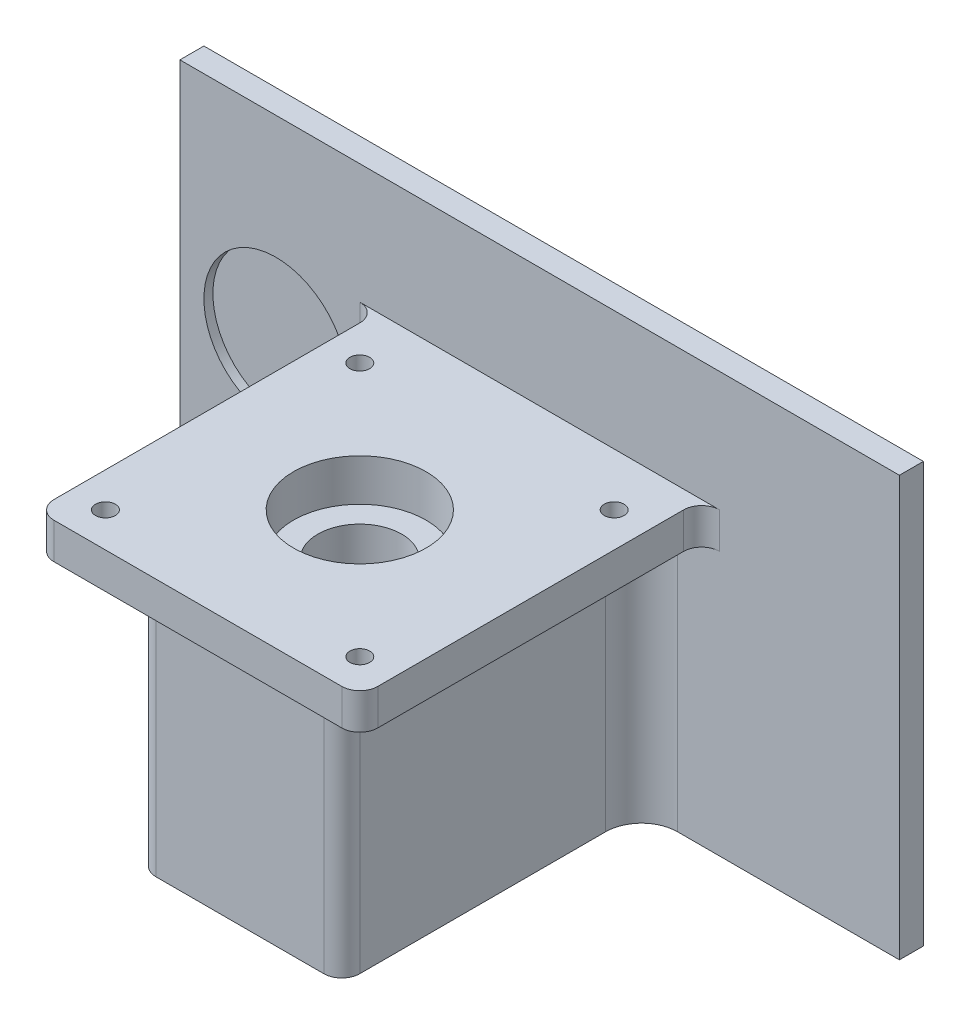
ISO-10303-21;
HEADER;
FILE_DESCRIPTION(('STEP AP214'),'2;1');
FILE_NAME('part.step','',(''),(''),'','','');
FILE_SCHEMA(('AUTOMOTIVE_DESIGN { 1 0 10303 214 1 1 1 1 }'));
ENDSEC;
DATA;
#1=APPLICATION_CONTEXT('core data for automotive mechanical design processes');
#2=APPLICATION_PROTOCOL_DEFINITION('international standard','automotive_design',2000,#1);
#3=PRODUCT_CONTEXT('',#1,'mechanical');
#4=PRODUCT('Part','Part','',(#3));
#5=PRODUCT_RELATED_PRODUCT_CATEGORY('part','',(#4));
#6=PRODUCT_DEFINITION_FORMATION('','',#4);
#7=PRODUCT_DEFINITION_CONTEXT('part definition',#1,'design');
#8=PRODUCT_DEFINITION('design','',#6,#7);
#9=PRODUCT_DEFINITION_SHAPE('','',#8);
#10=(LENGTH_UNIT() NAMED_UNIT(*) SI_UNIT(.MILLI.,.METRE.));
#11=(NAMED_UNIT(*) PLANE_ANGLE_UNIT() SI_UNIT($,.RADIAN.));
#12=(NAMED_UNIT(*) SI_UNIT($,.STERADIAN.) SOLID_ANGLE_UNIT());
#13=UNCERTAINTY_MEASURE_WITH_UNIT(LENGTH_MEASURE(1.E-05),#10,'distance_accuracy_value','');
#14=(GEOMETRIC_REPRESENTATION_CONTEXT(3) GLOBAL_UNCERTAINTY_ASSIGNED_CONTEXT((#13)) GLOBAL_UNIT_ASSIGNED_CONTEXT((#10,
#11,#12)) REPRESENTATION_CONTEXT('',''));
#15=CARTESIAN_POINT('',(0.,0.,0.));
#16=DIRECTION('',(0.,0.,1.));
#17=DIRECTION('',(1.,0.,0.));
#18=AXIS2_PLACEMENT_3D('',#15,#16,#17);
#19=CARTESIAN_POINT('',(0.,35.,34.));
#20=DIRECTION('',(0.,-1.,0.));
#21=DIRECTION('',(1.,0.,0.));
#22=AXIS2_PLACEMENT_3D('',#19,#20,#21);
#23=CYLINDRICAL_SURFACE('',#22,7.);
#24=CARTESIAN_POINT('',(0.,-28.,34.));
#25=DIRECTION('',(0.,-1.,0.));
#26=DIRECTION('',(1.,0.,0.));
#27=AXIS2_PLACEMENT_3D('',#24,#25,#26);
#28=CIRCLE('',#27,7.);
#29=CARTESIAN_POINT('',(7.,-28.,34.));
#30=VERTEX_POINT('',#29);
#31=EDGE_CURVE('E215',#30,#30,#28,.T.);
#32=ORIENTED_EDGE('',*,*,#31,.T.);
#33=EDGE_LOOP('',(#32));
#34=FACE_BOUND('',#33,.T.);
#35=CARTESIAN_POINT('',(0.,8.,34.));
#36=DIRECTION('',(0.,1.,0.));
#37=DIRECTION('',(-1.,0.,0.));
#38=AXIS2_PLACEMENT_3D('',#35,#36,#37);
#39=CIRCLE('',#38,7.);
#40=CARTESIAN_POINT('',(-7.,8.,34.));
#41=VERTEX_POINT('',#40);
#42=EDGE_CURVE('E208',#41,#41,#39,.F.);
#43=ORIENTED_EDGE('',*,*,#42,.F.);
#44=EDGE_LOOP('',(#43));
#45=FACE_BOUND('',#44,.T.);
#46=ADVANCED_FACE('F39',(#34,#45),#23,.F.);
#47=CARTESIAN_POINT('',(-60.,35.,4.));
#48=DIRECTION('',(0.,-1.,0.));
#49=DIRECTION('',(1.,0.,0.));
#50=AXIS2_PLACEMENT_3D('',#47,#48,#49);
#51=PLANE('',#50);
#52=DIRECTION('',(-1.,0.,0.));
#53=VECTOR('',#52,1.);
#54=CARTESIAN_POINT('',(-60.,35.,0.));
#55=LINE('',#54,#53);
#56=CARTESIAN_POINT('',(60.,35.,0.));
#57=VERTEX_POINT('',#56);
#58=CARTESIAN_POINT('',(-60.,35.,0.));
#59=VERTEX_POINT('',#58);
#60=EDGE_CURVE('E198',#57,#59,#55,.T.);
#61=ORIENTED_EDGE('',*,*,#60,.T.);
#62=DIRECTION('',(0.,0.,-1.));
#63=VECTOR('',#62,1.);
#64=CARTESIAN_POINT('',(-60.,35.,4.));
#65=LINE('',#64,#63);
#66=CARTESIAN_POINT('',(-60.,35.,4.));
#67=VERTEX_POINT('',#66);
#68=EDGE_CURVE('E177',#67,#59,#65,.T.);
#69=ORIENTED_EDGE('',*,*,#68,.F.);
#70=DIRECTION('',(-1.,0.,0.));
#71=VECTOR('',#70,1.);
#72=CARTESIAN_POINT('',(-60.,35.,4.));
#73=LINE('',#72,#71);
#74=CARTESIAN_POINT('',(60.,35.,4.));
#75=VERTEX_POINT('',#74);
#76=EDGE_CURVE('E184',#75,#67,#73,.T.);
#77=ORIENTED_EDGE('',*,*,#76,.F.);
#78=DIRECTION('',(0.,0.,-1.));
#79=VECTOR('',#78,1.);
#80=CARTESIAN_POINT('',(60.,35.,4.));
#81=LINE('',#80,#79);
#82=EDGE_CURVE('E353',#75,#57,#81,.T.);
#83=ORIENTED_EDGE('',*,*,#82,.T.);
#84=EDGE_LOOP('',(#61,#69,#77,#83));
#85=FACE_BOUND('',#84,.T.);
#86=ADVANCED_FACE('F200',(#85),#51,.F.);
#87=CARTESIAN_POINT('',(-60.,-35.,4.));
#88=DIRECTION('',(1.,0.,0.));
#89=DIRECTION('',(0.,0.,-1.));
#90=AXIS2_PLACEMENT_3D('',#87,#88,#89);
#91=PLANE('',#90);
#92=DIRECTION('',(0.,-1.,0.));
#93=VECTOR('',#92,1.);
#94=CARTESIAN_POINT('',(-60.,-35.,0.));
#95=LINE('',#94,#93);
#96=CARTESIAN_POINT('',(-60.,-35.,0.));
#97=VERTEX_POINT('',#96);
#98=EDGE_CURVE('E351',#59,#97,#95,.T.);
#99=ORIENTED_EDGE('',*,*,#98,.T.);
#100=DIRECTION('',(0.,0.,-1.));
#101=VECTOR('',#100,1.);
#102=CARTESIAN_POINT('',(-60.,-35.,4.));
#103=LINE('',#102,#101);
#104=CARTESIAN_POINT('',(-60.,-35.,4.));
#105=VERTEX_POINT('',#104);
#106=EDGE_CURVE('E185',#105,#97,#103,.T.);
#107=ORIENTED_EDGE('',*,*,#106,.F.);
#108=DIRECTION('',(0.,-1.,0.));
#109=VECTOR('',#108,1.);
#110=CARTESIAN_POINT('',(-60.,-35.,4.));
#111=LINE('',#110,#109);
#112=EDGE_CURVE('E174',#67,#105,#111,.T.);
#113=ORIENTED_EDGE('',*,*,#112,.F.);
#114=ORIENTED_EDGE('',*,*,#68,.T.);
#115=EDGE_LOOP('',(#99,#107,#113,#114));
#116=FACE_BOUND('',#115,.T.);
#117=ADVANCED_FACE('F180',(#116),#91,.F.);
#118=CARTESIAN_POINT('',(-60.,-35.,4.));
#119=DIRECTION('',(0.,1.,0.));
#120=DIRECTION('',(-1.,0.,0.));
#121=AXIS2_PLACEMENT_3D('',#118,#119,#120);
#122=PLANE('',#121);
#123=CARTESIAN_POINT('',(0.,-35.,34.));
#124=DIRECTION('',(0.,-1.,0.));
#125=DIRECTION('',(1.,0.,0.));
#126=AXIS2_PLACEMENT_3D('',#123,#124,#125);
#127=CIRCLE('',#126,11.1);
#128=CARTESIAN_POINT('',(11.1,-35.,34.));
#129=VERTEX_POINT('',#128);
#130=EDGE_CURVE('E340',#129,#129,#127,.T.);
#131=ORIENTED_EDGE('',*,*,#130,.F.);
#132=EDGE_LOOP('',(#131));
#133=FACE_BOUND('',#132,.T.);
#134=DIRECTION('',(1.,0.,0.));
#135=VECTOR('',#134,1.);
#136=CARTESIAN_POINT('',(-17.,-35.,54.));
#137=LINE('',#136,#135);
#138=CARTESIAN_POINT('',(-14.,-35.,54.));
#139=VERTEX_POINT('',#138);
#140=CARTESIAN_POINT('',(14.,-35.,54.));
#141=VERTEX_POINT('',#140);
#142=EDGE_CURVE('E296',#139,#141,#137,.T.);
#143=ORIENTED_EDGE('',*,*,#142,.F.);
#144=CARTESIAN_POINT('',(-14.,-35.,51.));
#145=DIRECTION('',(0.,1.,0.));
#146=DIRECTION('',(-1.,0.,0.));
#147=AXIS2_PLACEMENT_3D('',#144,#145,#146);
#148=CIRCLE('',#147,3.);
#149=CARTESIAN_POINT('',(-17.,-35.,51.));
#150=VERTEX_POINT('',#149);
#151=EDGE_CURVE('E247',#139,#150,#148,.F.);
#152=ORIENTED_EDGE('',*,*,#151,.T.);
#153=DIRECTION('',(0.,0.,-1.));
#154=VECTOR('',#153,1.);
#155=CARTESIAN_POINT('',(-17.,-35.,54.));
#156=LINE('',#155,#154);
#157=CARTESIAN_POINT('',(-17.,-35.,10.));
#158=VERTEX_POINT('',#157);
#159=EDGE_CURVE('E300',#150,#158,#156,.T.);
#160=ORIENTED_EDGE('',*,*,#159,.T.);
#161=CARTESIAN_POINT('',(-23.,-35.,10.));
#162=DIRECTION('',(0.,1.,0.));
#163=DIRECTION('',(-1.,0.,0.));
#164=AXIS2_PLACEMENT_3D('',#161,#162,#163);
#165=CIRCLE('',#164,6.);
#166=CARTESIAN_POINT('',(-23.,-35.,4.));
#167=VERTEX_POINT('',#166);
#168=EDGE_CURVE('E11',#158,#167,#165,.T.);
#169=ORIENTED_EDGE('',*,*,#168,.T.);
#170=DIRECTION('',(1.,0.,0.));
#171=VECTOR('',#170,1.);
#172=CARTESIAN_POINT('',(-60.,-35.,4.));
#173=LINE('',#172,#171);
#174=EDGE_CURVE('E350',#105,#167,#173,.T.);
#175=ORIENTED_EDGE('',*,*,#174,.F.);
#176=ORIENTED_EDGE('',*,*,#106,.T.);
#177=DIRECTION('',(1.,0.,0.));
#178=VECTOR('',#177,1.);
#179=CARTESIAN_POINT('',(-60.,-35.,0.));
#180=LINE('',#179,#178);
#181=CARTESIAN_POINT('',(60.,-35.,0.));
#182=VERTEX_POINT('',#181);
#183=EDGE_CURVE('E354',#97,#182,#180,.T.);
#184=ORIENTED_EDGE('',*,*,#183,.T.);
#185=DIRECTION('',(0.,0.,-1.));
#186=VECTOR('',#185,1.);
#187=CARTESIAN_POINT('',(60.,-35.,4.));
#188=LINE('',#187,#186);
#189=CARTESIAN_POINT('',(60.,-35.,4.));
#190=VERTEX_POINT('',#189);
#191=EDGE_CURVE('E207',#190,#182,#188,.T.);
#192=ORIENTED_EDGE('',*,*,#191,.F.);
#193=CARTESIAN_POINT('',(23.,-35.,4.));
#194=VERTEX_POINT('',#193);
#195=EDGE_CURVE('E183',#194,#190,#173,.T.);
#196=ORIENTED_EDGE('',*,*,#195,.F.);
#197=CARTESIAN_POINT('',(23.,-35.,10.));
#198=DIRECTION('',(0.,1.,0.));
#199=DIRECTION('',(-1.,0.,0.));
#200=AXIS2_PLACEMENT_3D('',#197,#198,#199);
#201=CIRCLE('',#200,6.);
#202=CARTESIAN_POINT('',(17.,-35.,10.));
#203=VERTEX_POINT('',#202);
#204=EDGE_CURVE('E50',#194,#203,#201,.T.);
#205=ORIENTED_EDGE('',*,*,#204,.T.);
#206=DIRECTION('',(0.,0.,-1.));
#207=VECTOR('',#206,1.);
#208=CARTESIAN_POINT('',(17.,-35.,54.));
#209=LINE('',#208,#207);
#210=CARTESIAN_POINT('',(17.,-35.,51.));
#211=VERTEX_POINT('',#210);
#212=EDGE_CURVE('E290',#211,#203,#209,.T.);
#213=ORIENTED_EDGE('',*,*,#212,.F.);
#214=CARTESIAN_POINT('',(14.,-35.,51.));
#215=DIRECTION('',(0.,1.,0.));
#216=DIRECTION('',(-1.,0.,0.));
#217=AXIS2_PLACEMENT_3D('',#214,#215,#216);
#218=CIRCLE('',#217,3.);
#219=EDGE_CURVE('E246',#211,#141,#218,.F.);
#220=ORIENTED_EDGE('',*,*,#219,.T.);
#221=EDGE_LOOP('',(#143,#152,#160,#169,#175,#176,#184,#192,#196,#205,#213,#220));
#222=FACE_BOUND('',#221,.T.);
#223=ADVANCED_FACE('F288',(#133,#222),#122,.F.);
#224=CARTESIAN_POINT('',(60.,-35.,4.));
#225=DIRECTION('',(-1.,0.,0.));
#226=DIRECTION('',(0.,0.,1.));
#227=AXIS2_PLACEMENT_3D('',#224,#225,#226);
#228=PLANE('',#227);
#229=DIRECTION('',(0.,1.,0.));
#230=VECTOR('',#229,1.);
#231=CARTESIAN_POINT('',(60.,-35.,0.));
#232=LINE('',#231,#230);
#233=EDGE_CURVE('E197',#182,#57,#232,.T.);
#234=ORIENTED_EDGE('',*,*,#233,.T.);
#235=ORIENTED_EDGE('',*,*,#82,.F.);
#236=DIRECTION('',(0.,1.,0.));
#237=VECTOR('',#236,1.);
#238=CARTESIAN_POINT('',(60.,-35.,4.));
#239=LINE('',#238,#237);
#240=EDGE_CURVE('E195',#190,#75,#239,.T.);
#241=ORIENTED_EDGE('',*,*,#240,.F.);
#242=ORIENTED_EDGE('',*,*,#191,.T.);
#243=EDGE_LOOP('',(#234,#235,#241,#242));
#244=FACE_BOUND('',#243,.T.);
#245=ADVANCED_FACE('F363',(#244),#228,.F.);
#246=CARTESIAN_POINT('',(0.,0.,4.));
#247=DIRECTION('',(0.,0.,1.));
#248=DIRECTION('',(1.,0.,0.));
#249=AXIS2_PLACEMENT_3D('',#246,#247,#248);
#250=PLANE('',#249);
#251=DIRECTION('',(-1.,0.,0.));
#252=VECTOR('',#251,1.);
#253=CARTESIAN_POINT('',(17.,9.,4.));
#254=LINE('',#253,#252);
#255=CARTESIAN_POINT('',(30.,9.,4.));
#256=VERTEX_POINT('',#255);
#257=CARTESIAN_POINT('',(23.,9.,4.));
#258=VERTEX_POINT('',#257);
#259=EDGE_CURVE('E303',#256,#258,#254,.T.);
#260=ORIENTED_EDGE('',*,*,#259,.T.);
#261=DIRECTION('',(0.,1.,0.));
#262=VECTOR('',#261,1.);
#263=CARTESIAN_POINT('',(23.,0.,4.));
#264=LINE('',#263,#262);
#265=EDGE_CURVE('E277',#258,#194,#264,.F.);
#266=ORIENTED_EDGE('',*,*,#265,.T.);
#267=ORIENTED_EDGE('',*,*,#195,.T.);
#268=ORIENTED_EDGE('',*,*,#240,.T.);
#269=ORIENTED_EDGE('',*,*,#76,.T.);
#270=ORIENTED_EDGE('',*,*,#112,.T.);
#271=ORIENTED_EDGE('',*,*,#174,.T.);
#272=DIRECTION('',(0.,-1.,0.));
#273=VECTOR('',#272,1.);
#274=CARTESIAN_POINT('',(-23.,0.,4.));
#275=LINE('',#274,#273);
#276=CARTESIAN_POINT('',(-23.,9.,4.));
#277=VERTEX_POINT('',#276);
#278=EDGE_CURVE('E276',#167,#277,#275,.F.);
#279=ORIENTED_EDGE('',*,*,#278,.T.);
#280=DIRECTION('',(-1.,0.,0.));
#281=VECTOR('',#280,1.);
#282=CARTESIAN_POINT('',(-27.,9.,4.));
#283=LINE('',#282,#281);
#284=CARTESIAN_POINT('',(-30.,9.,4.));
#285=VERTEX_POINT('',#284);
#286=EDGE_CURVE('E371',#277,#285,#283,.T.);
#287=ORIENTED_EDGE('',*,*,#286,.T.);
#288=DIRECTION('',(0.,1.,0.));
#289=VECTOR('',#288,1.);
#290=CARTESIAN_POINT('',(-30.,15.,4.));
#291=LINE('',#290,#289);
#292=CARTESIAN_POINT('',(-30.,15.,4.));
#293=VERTEX_POINT('',#292);
#294=EDGE_CURVE('E202',#285,#293,#291,.T.);
#295=ORIENTED_EDGE('',*,*,#294,.T.);
#296=DIRECTION('',(-1.,0.,0.));
#297=VECTOR('',#296,1.);
#298=CARTESIAN_POINT('',(-17.,15.,4.));
#299=LINE('',#298,#297);
#300=CARTESIAN_POINT('',(30.,15.,4.));
#301=VERTEX_POINT('',#300);
#302=EDGE_CURVE('E341',#301,#293,#299,.T.);
#303=ORIENTED_EDGE('',*,*,#302,.F.);
#304=DIRECTION('',(0.,1.,0.));
#305=VECTOR('',#304,1.);
#306=CARTESIAN_POINT('',(30.,9.,4.));
#307=LINE('',#306,#305);
#308=EDGE_CURVE('E203',#301,#256,#307,.F.);
#309=ORIENTED_EDGE('',*,*,#308,.T.);
#310=EDGE_LOOP('',(#260,#266,#267,#268,#269,#270,#271,#279,#287,#295,#303,#309));
#311=FACE_BOUND('',#310,.T.);
#312=CARTESIAN_POINT('',(-44.,2.5,4.));
#313=DIRECTION('',(0.,0.,1.));
#314=DIRECTION('',(1.,0.,0.));
#315=AXIS2_PLACEMENT_3D('',#312,#313,#314);
#316=CIRCLE('',#315,12.);
#317=CARTESIAN_POINT('',(-32.,2.5,4.));
#318=VERTEX_POINT('',#317);
#319=EDGE_CURVE('E310',#318,#318,#316,.T.);
#320=ORIENTED_EDGE('',*,*,#319,.F.);
#321=EDGE_LOOP('',(#320));
#322=FACE_BOUND('',#321,.T.);
#323=ADVANCED_FACE('F186',(#311,#322),#250,.T.);
#324=CARTESIAN_POINT('',(0.,0.,0.));
#325=DIRECTION('',(0.,0.,1.));
#326=DIRECTION('',(1.,0.,0.));
#327=AXIS2_PLACEMENT_3D('',#324,#325,#326);
#328=PLANE('',#327);
#329=ORIENTED_EDGE('',*,*,#60,.F.);
#330=ORIENTED_EDGE('',*,*,#233,.F.);
#331=ORIENTED_EDGE('',*,*,#183,.F.);
#332=ORIENTED_EDGE('',*,*,#98,.F.);
#333=EDGE_LOOP('',(#329,#330,#331,#332));
#334=FACE_BOUND('',#333,.T.);
#335=ADVANCED_FACE('F364',(#334),#328,.F.);
#336=CARTESIAN_POINT('',(17.,15.,54.));
#337=DIRECTION('',(-1.,0.,0.));
#338=DIRECTION('',(0.,-1.,0.));
#339=AXIS2_PLACEMENT_3D('',#336,#337,#338);
#340=PLANE('',#339);
#341=ORIENTED_EDGE('',*,*,#212,.T.);
#342=DIRECTION('',(0.,1.,0.));
#343=VECTOR('',#342,1.);
#344=CARTESIAN_POINT('',(17.,15.,10.));
#345=LINE('',#344,#343);
#346=CARTESIAN_POINT('',(17.,9.,10.));
#347=VERTEX_POINT('',#346);
#348=EDGE_CURVE('E267',#203,#347,#345,.T.);
#349=ORIENTED_EDGE('',*,*,#348,.T.);
#350=DIRECTION('',(0.,0.,1.));
#351=VECTOR('',#350,1.);
#352=CARTESIAN_POINT('',(17.,9.,54.));
#353=LINE('',#352,#351);
#354=CARTESIAN_POINT('',(17.,9.,51.));
#355=VERTEX_POINT('',#354);
#356=EDGE_CURVE('E302',#347,#355,#353,.T.);
#357=ORIENTED_EDGE('',*,*,#356,.T.);
#358=DIRECTION('',(0.,1.,0.));
#359=VECTOR('',#358,1.);
#360=CARTESIAN_POINT('',(17.,-35.,51.));
#361=LINE('',#360,#359);
#362=EDGE_CURVE('E255',#355,#211,#361,.F.);
#363=ORIENTED_EDGE('',*,*,#362,.T.);
#364=EDGE_LOOP('',(#341,#349,#357,#363));
#365=FACE_BOUND('',#364,.T.);
#366=ADVANCED_FACE('F295',(#365),#340,.F.);
#367=CARTESIAN_POINT('',(-17.,15.,54.));
#368=DIRECTION('',(0.,-1.,0.));
#369=DIRECTION('',(0.,0.,-1.));
#370=AXIS2_PLACEMENT_3D('',#367,#368,#369);
#371=PLANE('',#370);
#372=DIRECTION('',(1.,0.,0.));
#373=VECTOR('',#372,1.);
#374=CARTESIAN_POINT('',(27.,15.,61.));
#375=LINE('',#374,#373);
#376=CARTESIAN_POINT('',(-24.,15.,61.));
#377=VERTEX_POINT('',#376);
#378=CARTESIAN_POINT('',(24.,15.,61.));
#379=VERTEX_POINT('',#378);
#380=EDGE_CURVE('E321',#377,#379,#375,.T.);
#381=ORIENTED_EDGE('',*,*,#380,.T.);
#382=CARTESIAN_POINT('',(24.,15.,58.));
#383=DIRECTION('',(0.,-1.,0.));
#384=DIRECTION('',(0.,0.,-1.));
#385=AXIS2_PLACEMENT_3D('',#382,#383,#384);
#386=CIRCLE('',#385,3.);
#387=CARTESIAN_POINT('',(27.,15.,58.));
#388=VERTEX_POINT('',#387);
#389=EDGE_CURVE('E234',#379,#388,#386,.F.);
#390=ORIENTED_EDGE('',*,*,#389,.T.);
#391=DIRECTION('',(0.,0.,-1.));
#392=VECTOR('',#391,1.);
#393=CARTESIAN_POINT('',(27.,15.,4.));
#394=LINE('',#393,#392);
#395=CARTESIAN_POINT('',(27.,15.,7.));
#396=VERTEX_POINT('',#395);
#397=EDGE_CURVE('E324',#388,#396,#394,.T.);
#398=ORIENTED_EDGE('',*,*,#397,.T.);
#399=CARTESIAN_POINT('',(30.,15.,7.));
#400=DIRECTION('',(0.,-1.,0.));
#401=DIRECTION('',(0.,0.,-1.));
#402=AXIS2_PLACEMENT_3D('',#399,#400,#401);
#403=CIRCLE('',#402,3.);
#404=EDGE_CURVE('E258',#396,#301,#403,.T.);
#405=ORIENTED_EDGE('',*,*,#404,.T.);
#406=ORIENTED_EDGE('',*,*,#302,.T.);
#407=CARTESIAN_POINT('',(-30.,15.,7.));
#408=DIRECTION('',(0.,-1.,0.));
#409=DIRECTION('',(0.,0.,-1.));
#410=AXIS2_PLACEMENT_3D('',#407,#408,#409);
#411=CIRCLE('',#410,3.);
#412=CARTESIAN_POINT('',(-27.,15.,7.));
#413=VERTEX_POINT('',#412);
#414=EDGE_CURVE('E251',#293,#413,#411,.T.);
#415=ORIENTED_EDGE('',*,*,#414,.T.);
#416=DIRECTION('',(0.,0.,1.));
#417=VECTOR('',#416,1.);
#418=CARTESIAN_POINT('',(-27.,15.,61.));
#419=LINE('',#418,#417);
#420=CARTESIAN_POINT('',(-27.,15.,58.));
#421=VERTEX_POINT('',#420);
#422=EDGE_CURVE('E319',#413,#421,#419,.T.);
#423=ORIENTED_EDGE('',*,*,#422,.T.);
#424=CARTESIAN_POINT('',(-24.,15.,58.));
#425=DIRECTION('',(0.,-1.,0.));
#426=DIRECTION('',(0.,0.,-1.));
#427=AXIS2_PLACEMENT_3D('',#424,#425,#426);
#428=CIRCLE('',#427,3.);
#429=EDGE_CURVE('E235',#421,#377,#428,.F.);
#430=ORIENTED_EDGE('',*,*,#429,.T.);
#431=EDGE_LOOP('',(#381,#390,#398,#405,#406,#415,#423,#430));
#432=FACE_BOUND('',#431,.T.);
#433=CARTESIAN_POINT('',(0.,15.,34.));
#434=DIRECTION('',(0.,1.,0.));
#435=DIRECTION('',(-1.,0.,0.));
#436=AXIS2_PLACEMENT_3D('',#433,#434,#435);
#437=CIRCLE('',#436,11.05);
#438=CARTESIAN_POINT('',(-11.05,15.,34.));
#439=VERTEX_POINT('',#438);
#440=EDGE_CURVE('E326',#439,#439,#437,.T.);
#441=ORIENTED_EDGE('',*,*,#440,.F.);
#442=EDGE_LOOP('',(#441));
#443=FACE_BOUND('',#442,.T.);
#444=CARTESIAN_POINT('',(-21.2132034355964,15.,12.7867965644036));
#445=DIRECTION('',(0.,1.,0.));
#446=DIRECTION('',(0.,0.,1.));
#447=AXIS2_PLACEMENT_3D('',#444,#445,#446);
#448=CIRCLE('',#447,1.65);
#449=CARTESIAN_POINT('',(-21.2132034355964,15.,14.4367965644036));
#450=VERTEX_POINT('',#449);
#451=EDGE_CURVE('E698',#450,#450,#448,.T.);
#452=ORIENTED_EDGE('',*,*,#451,.F.);
#453=EDGE_LOOP('',(#452));
#454=FACE_BOUND('',#453,.T.);
#455=CARTESIAN_POINT('',(21.2132034355964,15.,12.7867965644036));
#456=DIRECTION('',(0.,1.,0.));
#457=DIRECTION('',(0.,0.,1.));
#458=AXIS2_PLACEMENT_3D('',#455,#456,#457);
#459=CIRCLE('',#458,1.65);
#460=CARTESIAN_POINT('',(21.2132034355964,15.,14.4367965644036));
#461=VERTEX_POINT('',#460);
#462=EDGE_CURVE('E701',#461,#461,#459,.T.);
#463=ORIENTED_EDGE('',*,*,#462,.F.);
#464=EDGE_LOOP('',(#463));
#465=FACE_BOUND('',#464,.T.);
#466=CARTESIAN_POINT('',(-21.2132034355964,15.,55.2132034355964));
#467=DIRECTION('',(0.,1.,0.));
#468=DIRECTION('',(0.,0.,1.));
#469=AXIS2_PLACEMENT_3D('',#466,#467,#468);
#470=CIRCLE('',#469,1.65);
#471=CARTESIAN_POINT('',(-21.2132034355964,15.,56.8632034355964));
#472=VERTEX_POINT('',#471);
#473=EDGE_CURVE('E710',#472,#472,#470,.T.);
#474=ORIENTED_EDGE('',*,*,#473,.F.);
#475=EDGE_LOOP('',(#474));
#476=FACE_BOUND('',#475,.T.);
#477=CARTESIAN_POINT('',(21.2132034355964,15.,55.2132034355964));
#478=DIRECTION('',(0.,1.,0.));
#479=DIRECTION('',(0.,0.,1.));
#480=AXIS2_PLACEMENT_3D('',#477,#478,#479);
#481=CIRCLE('',#480,1.65);
#482=CARTESIAN_POINT('',(21.2132034355964,15.,56.8632034355964));
#483=VERTEX_POINT('',#482);
#484=EDGE_CURVE('E712',#483,#483,#481,.T.);
#485=ORIENTED_EDGE('',*,*,#484,.F.);
#486=EDGE_LOOP('',(#485));
#487=FACE_BOUND('',#486,.T.);
#488=ADVANCED_FACE('F397',(#432,#443,#454,#465,#476,#487),#371,.F.);
#489=CARTESIAN_POINT('',(-17.,15.,54.));
#490=DIRECTION('',(1.,0.,0.));
#491=DIRECTION('',(0.,1.,0.));
#492=AXIS2_PLACEMENT_3D('',#489,#490,#491);
#493=PLANE('',#492);
#494=DIRECTION('',(0.,0.,-1.));
#495=VECTOR('',#494,1.);
#496=CARTESIAN_POINT('',(-17.,9.,4.));
#497=LINE('',#496,#495);
#498=CARTESIAN_POINT('',(-17.,9.,51.));
#499=VERTEX_POINT('',#498);
#500=CARTESIAN_POINT('',(-17.,9.,10.));
#501=VERTEX_POINT('',#500);
#502=EDGE_CURVE('E367',#499,#501,#497,.T.);
#503=ORIENTED_EDGE('',*,*,#502,.T.);
#504=DIRECTION('',(0.,-1.,0.));
#505=VECTOR('',#504,1.);
#506=CARTESIAN_POINT('',(-17.,15.,10.));
#507=LINE('',#506,#505);
#508=EDGE_CURVE('E279',#501,#158,#507,.T.);
#509=ORIENTED_EDGE('',*,*,#508,.T.);
#510=ORIENTED_EDGE('',*,*,#159,.F.);
#511=DIRECTION('',(0.,-1.,0.));
#512=VECTOR('',#511,1.);
#513=CARTESIAN_POINT('',(-17.,9.,51.));
#514=LINE('',#513,#512);
#515=EDGE_CURVE('E249',#150,#499,#514,.F.);
#516=ORIENTED_EDGE('',*,*,#515,.T.);
#517=EDGE_LOOP('',(#503,#509,#510,#516));
#518=FACE_BOUND('',#517,.T.);
#519=ADVANCED_FACE('F373',(#518),#493,.F.);
#520=CARTESIAN_POINT('',(0.,0.,54.));
#521=DIRECTION('',(0.,0.,1.));
#522=DIRECTION('',(1.,0.,0.));
#523=AXIS2_PLACEMENT_3D('',#520,#521,#522);
#524=PLANE('',#523);
#525=DIRECTION('',(-1.,0.,0.));
#526=VECTOR('',#525,1.);
#527=CARTESIAN_POINT('',(-17.,9.,54.));
#528=LINE('',#527,#526);
#529=CARTESIAN_POINT('',(14.,9.,54.));
#530=VERTEX_POINT('',#529);
#531=CARTESIAN_POINT('',(-14.,9.,54.));
#532=VERTEX_POINT('',#531);
#533=EDGE_CURVE('E376',#530,#532,#528,.T.);
#534=ORIENTED_EDGE('',*,*,#533,.T.);
#535=DIRECTION('',(0.,-1.,0.));
#536=VECTOR('',#535,1.);
#537=CARTESIAN_POINT('',(-14.,-35.,54.));
#538=LINE('',#537,#536);
#539=EDGE_CURVE('E243',#532,#139,#538,.T.);
#540=ORIENTED_EDGE('',*,*,#539,.T.);
#541=ORIENTED_EDGE('',*,*,#142,.T.);
#542=DIRECTION('',(0.,1.,0.));
#543=VECTOR('',#542,1.);
#544=CARTESIAN_POINT('',(14.,9.,54.));
#545=LINE('',#544,#543);
#546=EDGE_CURVE('E239',#141,#530,#545,.T.);
#547=ORIENTED_EDGE('',*,*,#546,.T.);
#548=EDGE_LOOP('',(#534,#540,#541,#547));
#549=FACE_BOUND('',#548,.T.);
#550=ADVANCED_FACE('F455',(#549),#524,.T.);
#551=CARTESIAN_POINT('',(0.,-28.,34.));
#552=DIRECTION('',(0.,-1.,0.));
#553=DIRECTION('',(1.,0.,0.));
#554=AXIS2_PLACEMENT_3D('',#551,#552,#553);
#555=CYLINDRICAL_SURFACE('',#554,11.1);
#556=CARTESIAN_POINT('',(0.,-28.,34.));
#557=DIRECTION('',(0.,-1.,0.));
#558=DIRECTION('',(1.,0.,0.));
#559=AXIS2_PLACEMENT_3D('',#556,#557,#558);
#560=CIRCLE('',#559,11.1);
#561=CARTESIAN_POINT('',(11.1,-28.,34.));
#562=VERTEX_POINT('',#561);
#563=EDGE_CURVE('E336',#562,#562,#560,.T.);
#564=ORIENTED_EDGE('',*,*,#563,.F.);
#565=EDGE_LOOP('',(#564));
#566=FACE_BOUND('',#565,.T.);
#567=ORIENTED_EDGE('',*,*,#130,.T.);
#568=EDGE_LOOP('',(#567));
#569=FACE_BOUND('',#568,.T.);
#570=ADVANCED_FACE('F449',(#566,#569),#555,.F.);
#571=CARTESIAN_POINT('',(0.,-28.,34.));
#572=DIRECTION('',(0.,-1.,0.));
#573=DIRECTION('',(1.,0.,0.));
#574=AXIS2_PLACEMENT_3D('',#571,#572,#573);
#575=PLANE('',#574);
#576=ORIENTED_EDGE('',*,*,#31,.F.);
#577=EDGE_LOOP('',(#576));
#578=FACE_BOUND('',#577,.T.);
#579=ORIENTED_EDGE('',*,*,#563,.T.);
#580=EDGE_LOOP('',(#579));
#581=FACE_BOUND('',#580,.T.);
#582=ADVANCED_FACE('F444',(#578,#581),#575,.T.);
#583=CARTESIAN_POINT('',(0.,8.,34.));
#584=DIRECTION('',(0.,1.,0.));
#585=DIRECTION('',(-1.,0.,0.));
#586=AXIS2_PLACEMENT_3D('',#583,#584,#585);
#587=PLANE('',#586);
#588=CARTESIAN_POINT('',(0.,8.,34.));
#589=DIRECTION('',(0.,1.,0.));
#590=DIRECTION('',(-1.,0.,0.));
#591=AXIS2_PLACEMENT_3D('',#588,#589,#590);
#592=CIRCLE('',#591,11.05);
#593=CARTESIAN_POINT('',(-11.05,8.,34.));
#594=VERTEX_POINT('',#593);
#595=EDGE_CURVE('E212',#594,#594,#592,.T.);
#596=ORIENTED_EDGE('',*,*,#595,.T.);
#597=EDGE_LOOP('',(#596));
#598=FACE_BOUND('',#597,.T.);
#599=ORIENTED_EDGE('',*,*,#42,.T.);
#600=EDGE_LOOP('',(#599));
#601=FACE_BOUND('',#600,.T.);
#602=ADVANCED_FACE('F450',(#598,#601),#587,.T.);
#603=CARTESIAN_POINT('',(0.,8.,34.));
#604=DIRECTION('',(0.,1.,0.));
#605=DIRECTION('',(-1.,0.,0.));
#606=AXIS2_PLACEMENT_3D('',#603,#604,#605);
#607=CYLINDRICAL_SURFACE('',#606,11.05);
#608=ORIENTED_EDGE('',*,*,#595,.F.);
#609=EDGE_LOOP('',(#608));
#610=FACE_BOUND('',#609,.T.);
#611=ORIENTED_EDGE('',*,*,#440,.T.);
#612=EDGE_LOOP('',(#611));
#613=FACE_BOUND('',#612,.T.);
#614=ADVANCED_FACE('F442',(#610,#613),#607,.F.);
#615=CARTESIAN_POINT('',(-44.,2.5,2.5));
#616=DIRECTION('',(0.,0.,1.));
#617=DIRECTION('',(1.,0.,0.));
#618=AXIS2_PLACEMENT_3D('',#615,#616,#617);
#619=CYLINDRICAL_SURFACE('',#618,12.);
#620=CARTESIAN_POINT('',(-44.,2.5,2.5));
#621=DIRECTION('',(0.,0.,1.));
#622=DIRECTION('',(1.,0.,0.));
#623=AXIS2_PLACEMENT_3D('',#620,#621,#622);
#624=CIRCLE('',#623,12.);
#625=CARTESIAN_POINT('',(-32.,2.5,2.5));
#626=VERTEX_POINT('',#625);
#627=EDGE_CURVE('E311',#626,#626,#624,.T.);
#628=ORIENTED_EDGE('',*,*,#627,.F.);
#629=EDGE_LOOP('',(#628));
#630=FACE_BOUND('',#629,.T.);
#631=ORIENTED_EDGE('',*,*,#319,.T.);
#632=EDGE_LOOP('',(#631));
#633=FACE_BOUND('',#632,.T.);
#634=ADVANCED_FACE('F596',(#630,#633),#619,.F.);
#635=CARTESIAN_POINT('',(-44.,2.5,2.5));
#636=DIRECTION('',(0.,0.,1.));
#637=DIRECTION('',(1.,0.,0.));
#638=AXIS2_PLACEMENT_3D('',#635,#636,#637);
#639=PLANE('',#638);
#640=ORIENTED_EDGE('',*,*,#627,.T.);
#641=EDGE_LOOP('',(#640));
#642=FACE_BOUND('',#641,.T.);
#643=ADVANCED_FACE('F609',(#642),#639,.T.);
#644=CARTESIAN_POINT('',(27.,9.,4.));
#645=DIRECTION('',(1.,0.,0.));
#646=DIRECTION('',(0.,0.,-1.));
#647=AXIS2_PLACEMENT_3D('',#644,#645,#646);
#648=PLANE('',#647);
#649=DIRECTION('',(0.,0.,-1.));
#650=VECTOR('',#649,1.);
#651=CARTESIAN_POINT('',(27.,9.,4.));
#652=LINE('',#651,#650);
#653=CARTESIAN_POINT('',(27.,9.,58.));
#654=VERTEX_POINT('',#653);
#655=CARTESIAN_POINT('',(27.,9.,7.));
#656=VERTEX_POINT('',#655);
#657=EDGE_CURVE('E308',#654,#656,#652,.T.);
#658=ORIENTED_EDGE('',*,*,#657,.T.);
#659=DIRECTION('',(0.,1.,0.));
#660=VECTOR('',#659,1.);
#661=CARTESIAN_POINT('',(27.,15.,7.));
#662=LINE('',#661,#660);
#663=EDGE_CURVE('E222',#656,#396,#662,.T.);
#664=ORIENTED_EDGE('',*,*,#663,.T.);
#665=ORIENTED_EDGE('',*,*,#397,.F.);
#666=DIRECTION('',(0.,1.,0.));
#667=VECTOR('',#666,1.);
#668=CARTESIAN_POINT('',(27.,9.,58.));
#669=LINE('',#668,#667);
#670=EDGE_CURVE('E225',#388,#654,#669,.F.);
#671=ORIENTED_EDGE('',*,*,#670,.T.);
#672=EDGE_LOOP('',(#658,#664,#665,#671));
#673=FACE_BOUND('',#672,.T.);
#674=ADVANCED_FACE('F405',(#673),#648,.T.);
#675=CARTESIAN_POINT('',(27.,9.,61.));
#676=DIRECTION('',(0.,0.,1.));
#677=DIRECTION('',(1.,0.,0.));
#678=AXIS2_PLACEMENT_3D('',#675,#676,#677);
#679=PLANE('',#678);
#680=DIRECTION('',(1.,0.,0.));
#681=VECTOR('',#680,1.);
#682=CARTESIAN_POINT('',(27.,9.,61.));
#683=LINE('',#682,#681);
#684=CARTESIAN_POINT('',(-24.,9.,61.));
#685=VERTEX_POINT('',#684);
#686=CARTESIAN_POINT('',(24.,9.,61.));
#687=VERTEX_POINT('',#686);
#688=EDGE_CURVE('E313',#685,#687,#683,.T.);
#689=ORIENTED_EDGE('',*,*,#688,.T.);
#690=DIRECTION('',(0.,1.,0.));
#691=VECTOR('',#690,1.);
#692=CARTESIAN_POINT('',(24.,9.,61.));
#693=LINE('',#692,#691);
#694=EDGE_CURVE('E230',#687,#379,#693,.T.);
#695=ORIENTED_EDGE('',*,*,#694,.T.);
#696=ORIENTED_EDGE('',*,*,#380,.F.);
#697=DIRECTION('',(0.,1.,0.));
#698=VECTOR('',#697,1.);
#699=CARTESIAN_POINT('',(-24.,9.,61.));
#700=LINE('',#699,#698);
#701=EDGE_CURVE('E227',#377,#685,#700,.F.);
#702=ORIENTED_EDGE('',*,*,#701,.T.);
#703=EDGE_LOOP('',(#689,#695,#696,#702));
#704=FACE_BOUND('',#703,.T.);
#705=ADVANCED_FACE('F388',(#704),#679,.T.);
#706=CARTESIAN_POINT('',(-27.,9.,61.));
#707=DIRECTION('',(-1.,0.,0.));
#708=DIRECTION('',(0.,0.,1.));
#709=AXIS2_PLACEMENT_3D('',#706,#707,#708);
#710=PLANE('',#709);
#711=ORIENTED_EDGE('',*,*,#422,.F.);
#712=DIRECTION('',(0.,1.,0.));
#713=VECTOR('',#712,1.);
#714=CARTESIAN_POINT('',(-27.,9.,7.));
#715=LINE('',#714,#713);
#716=CARTESIAN_POINT('',(-27.,9.,7.));
#717=VERTEX_POINT('',#716);
#718=EDGE_CURVE('E218',#413,#717,#715,.F.);
#719=ORIENTED_EDGE('',*,*,#718,.T.);
#720=DIRECTION('',(0.,0.,1.));
#721=VECTOR('',#720,1.);
#722=CARTESIAN_POINT('',(-27.,9.,61.));
#723=LINE('',#722,#721);
#724=CARTESIAN_POINT('',(-27.,9.,58.));
#725=VERTEX_POINT('',#724);
#726=EDGE_CURVE('E377',#717,#725,#723,.T.);
#727=ORIENTED_EDGE('',*,*,#726,.T.);
#728=DIRECTION('',(0.,1.,0.));
#729=VECTOR('',#728,1.);
#730=CARTESIAN_POINT('',(-27.,9.,58.));
#731=LINE('',#730,#729);
#732=EDGE_CURVE('E219',#725,#421,#731,.T.);
#733=ORIENTED_EDGE('',*,*,#732,.T.);
#734=EDGE_LOOP('',(#711,#719,#727,#733));
#735=FACE_BOUND('',#734,.T.);
#736=ADVANCED_FACE('F420',(#735),#710,.T.);
#737=CARTESIAN_POINT('',(0.,9.,0.));
#738=DIRECTION('',(0.,-1.,0.));
#739=DIRECTION('',(0.,0.,-1.));
#740=AXIS2_PLACEMENT_3D('',#737,#738,#739);
#741=PLANE('',#740);
#742=CARTESIAN_POINT('',(-21.2132034355964,9.,12.7867965644036));
#743=DIRECTION('',(0.,1.,0.));
#744=DIRECTION('',(0.,0.,1.));
#745=AXIS2_PLACEMENT_3D('',#742,#743,#744);
#746=CIRCLE('',#745,1.65);
#747=CARTESIAN_POINT('',(-21.2132034355964,9.,14.4367965644036));
#748=VERTEX_POINT('',#747);
#749=EDGE_CURVE('E694',#748,#748,#746,.T.);
#750=ORIENTED_EDGE('',*,*,#749,.T.);
#751=EDGE_LOOP('',(#750));
#752=FACE_BOUND('',#751,.T.);
#753=CARTESIAN_POINT('',(21.2132034355964,9.,12.7867965644036));
#754=DIRECTION('',(0.,1.,0.));
#755=DIRECTION('',(0.,0.,1.));
#756=AXIS2_PLACEMENT_3D('',#753,#754,#755);
#757=CIRCLE('',#756,1.65);
#758=CARTESIAN_POINT('',(21.2132034355964,9.,14.4367965644036));
#759=VERTEX_POINT('',#758);
#760=EDGE_CURVE('E703',#759,#759,#757,.T.);
#761=ORIENTED_EDGE('',*,*,#760,.T.);
#762=EDGE_LOOP('',(#761));
#763=FACE_BOUND('',#762,.T.);
#764=CARTESIAN_POINT('',(-21.2132034355964,9.,55.2132034355964));
#765=DIRECTION('',(0.,1.,0.));
#766=DIRECTION('',(0.,0.,1.));
#767=AXIS2_PLACEMENT_3D('',#764,#765,#766);
#768=CIRCLE('',#767,1.65);
#769=CARTESIAN_POINT('',(-21.2132034355964,9.,56.8632034355964));
#770=VERTEX_POINT('',#769);
#771=EDGE_CURVE('E708',#770,#770,#768,.T.);
#772=ORIENTED_EDGE('',*,*,#771,.T.);
#773=EDGE_LOOP('',(#772));
#774=FACE_BOUND('',#773,.T.);
#775=CARTESIAN_POINT('',(21.2132034355964,9.,55.2132034355964));
#776=DIRECTION('',(0.,1.,0.));
#777=DIRECTION('',(0.,0.,1.));
#778=AXIS2_PLACEMENT_3D('',#775,#776,#777);
#779=CIRCLE('',#778,1.65);
#780=CARTESIAN_POINT('',(21.2132034355964,9.,56.8632034355964));
#781=VERTEX_POINT('',#780);
#782=EDGE_CURVE('E325',#781,#781,#779,.T.);
#783=ORIENTED_EDGE('',*,*,#782,.T.);
#784=EDGE_LOOP('',(#783));
#785=FACE_BOUND('',#784,.T.);
#786=ORIENTED_EDGE('',*,*,#356,.F.);
#787=CARTESIAN_POINT('',(23.,9.,10.));
#788=DIRECTION('',(0.,-1.,0.));
#789=DIRECTION('',(0.,0.,-1.));
#790=AXIS2_PLACEMENT_3D('',#787,#788,#789);
#791=CIRCLE('',#790,6.);
#792=EDGE_CURVE('E274',#347,#258,#791,.T.);
#793=ORIENTED_EDGE('',*,*,#792,.T.);
#794=ORIENTED_EDGE('',*,*,#259,.F.);
#795=CARTESIAN_POINT('',(30.,9.,7.));
#796=DIRECTION('',(0.,-1.,0.));
#797=DIRECTION('',(0.,0.,-1.));
#798=AXIS2_PLACEMENT_3D('',#795,#796,#797);
#799=CIRCLE('',#798,3.);
#800=EDGE_CURVE('E264',#256,#656,#799,.F.);
#801=ORIENTED_EDGE('',*,*,#800,.T.);
#802=ORIENTED_EDGE('',*,*,#657,.F.);
#803=CARTESIAN_POINT('',(24.,9.,58.));
#804=DIRECTION('',(0.,-1.,0.));
#805=DIRECTION('',(0.,0.,-1.));
#806=AXIS2_PLACEMENT_3D('',#803,#804,#805);
#807=CIRCLE('',#806,3.);
#808=EDGE_CURVE('E238',#654,#687,#807,.T.);
#809=ORIENTED_EDGE('',*,*,#808,.T.);
#810=ORIENTED_EDGE('',*,*,#688,.F.);
#811=CARTESIAN_POINT('',(-24.,9.,58.));
#812=DIRECTION('',(0.,-1.,0.));
#813=DIRECTION('',(0.,0.,-1.));
#814=AXIS2_PLACEMENT_3D('',#811,#812,#813);
#815=CIRCLE('',#814,3.);
#816=EDGE_CURVE('E236',#685,#725,#815,.T.);
#817=ORIENTED_EDGE('',*,*,#816,.T.);
#818=ORIENTED_EDGE('',*,*,#726,.F.);
#819=CARTESIAN_POINT('',(-30.,9.,7.));
#820=DIRECTION('',(0.,-1.,0.));
#821=DIRECTION('',(0.,0.,-1.));
#822=AXIS2_PLACEMENT_3D('',#819,#820,#821);
#823=CIRCLE('',#822,3.);
#824=EDGE_CURVE('E256',#717,#285,#823,.F.);
#825=ORIENTED_EDGE('',*,*,#824,.T.);
#826=ORIENTED_EDGE('',*,*,#286,.F.);
#827=CARTESIAN_POINT('',(-23.,9.,10.));
#828=DIRECTION('',(0.,-1.,0.));
#829=DIRECTION('',(0.,0.,-1.));
#830=AXIS2_PLACEMENT_3D('',#827,#828,#829);
#831=CIRCLE('',#830,6.);
#832=EDGE_CURVE('E275',#277,#501,#831,.T.);
#833=ORIENTED_EDGE('',*,*,#832,.T.);
#834=ORIENTED_EDGE('',*,*,#502,.F.);
#835=CARTESIAN_POINT('',(-14.,9.,51.));
#836=DIRECTION('',(0.,-1.,0.));
#837=DIRECTION('',(0.,0.,-1.));
#838=AXIS2_PLACEMENT_3D('',#835,#836,#837);
#839=CIRCLE('',#838,3.);
#840=EDGE_CURVE('E261',#499,#532,#839,.F.);
#841=ORIENTED_EDGE('',*,*,#840,.T.);
#842=ORIENTED_EDGE('',*,*,#533,.F.);
#843=CARTESIAN_POINT('',(14.,9.,51.));
#844=DIRECTION('',(0.,-1.,0.));
#845=DIRECTION('',(0.,0.,-1.));
#846=AXIS2_PLACEMENT_3D('',#843,#844,#845);
#847=CIRCLE('',#846,3.);
#848=EDGE_CURVE('E268',#530,#355,#847,.F.);
#849=ORIENTED_EDGE('',*,*,#848,.T.);
#850=EDGE_LOOP('',(#786,#793,#794,#801,#802,#809,#810,#817,#818,#825,#826,#833,#834,#841,#842,#849));
#851=FACE_BOUND('',#850,.T.);
#852=ADVANCED_FACE('F305',(#752,#763,#774,#785,#851),#741,.T.);
#853=CARTESIAN_POINT('',(21.2132034355964,9.,55.2132034355964));
#854=DIRECTION('',(0.,1.,0.));
#855=DIRECTION('',(0.,0.,1.));
#856=AXIS2_PLACEMENT_3D('',#853,#854,#855);
#857=CYLINDRICAL_SURFACE('',#856,1.65);
#858=ORIENTED_EDGE('',*,*,#782,.F.);
#859=EDGE_LOOP('',(#858));
#860=FACE_BOUND('',#859,.T.);
#861=ORIENTED_EDGE('',*,*,#484,.T.);
#862=EDGE_LOOP('',(#861));
#863=FACE_BOUND('',#862,.T.);
#864=ADVANCED_FACE('F526',(#860,#863),#857,.F.);
#865=CARTESIAN_POINT('',(-21.2132034355964,9.,55.2132034355964));
#866=DIRECTION('',(0.,1.,0.));
#867=DIRECTION('',(0.,0.,1.));
#868=AXIS2_PLACEMENT_3D('',#865,#866,#867);
#869=CYLINDRICAL_SURFACE('',#868,1.65);
#870=ORIENTED_EDGE('',*,*,#771,.F.);
#871=EDGE_LOOP('',(#870));
#872=FACE_BOUND('',#871,.T.);
#873=ORIENTED_EDGE('',*,*,#473,.T.);
#874=EDGE_LOOP('',(#873));
#875=FACE_BOUND('',#874,.T.);
#876=ADVANCED_FACE('F653',(#872,#875),#869,.F.);
#877=CARTESIAN_POINT('',(21.2132034355964,9.,12.7867965644036));
#878=DIRECTION('',(0.,1.,0.));
#879=DIRECTION('',(0.,0.,1.));
#880=AXIS2_PLACEMENT_3D('',#877,#878,#879);
#881=CYLINDRICAL_SURFACE('',#880,1.65);
#882=ORIENTED_EDGE('',*,*,#760,.F.);
#883=EDGE_LOOP('',(#882));
#884=FACE_BOUND('',#883,.T.);
#885=ORIENTED_EDGE('',*,*,#462,.T.);
#886=EDGE_LOOP('',(#885));
#887=FACE_BOUND('',#886,.T.);
#888=ADVANCED_FACE('F664',(#884,#887),#881,.F.);
#889=CARTESIAN_POINT('',(-21.2132034355964,9.,12.7867965644036));
#890=DIRECTION('',(0.,1.,0.));
#891=DIRECTION('',(0.,0.,1.));
#892=AXIS2_PLACEMENT_3D('',#889,#890,#891);
#893=CYLINDRICAL_SURFACE('',#892,1.65);
#894=ORIENTED_EDGE('',*,*,#749,.F.);
#895=EDGE_LOOP('',(#894));
#896=FACE_BOUND('',#895,.T.);
#897=ORIENTED_EDGE('',*,*,#451,.T.);
#898=EDGE_LOOP('',(#897));
#899=FACE_BOUND('',#898,.T.);
#900=ADVANCED_FACE('F477',(#896,#899),#893,.F.);
#901=CARTESIAN_POINT('',(-30.,0.,7.));
#902=DIRECTION('',(0.,-1.,0.));
#903=DIRECTION('',(0.,0.,-1.));
#904=AXIS2_PLACEMENT_3D('',#901,#902,#903);
#905=CYLINDRICAL_SURFACE('',#904,3.);
#906=ORIENTED_EDGE('',*,*,#824,.F.);
#907=ORIENTED_EDGE('',*,*,#718,.F.);
#908=ORIENTED_EDGE('',*,*,#414,.F.);
#909=ORIENTED_EDGE('',*,*,#294,.F.);
#910=EDGE_LOOP('',(#906,#907,#908,#909));
#911=FACE_BOUND('',#910,.T.);
#912=ADVANCED_FACE('F415',(#911),#905,.F.);
#913=CARTESIAN_POINT('',(30.,9.,7.));
#914=DIRECTION('',(0.,-1.,0.));
#915=DIRECTION('',(0.,0.,-1.));
#916=AXIS2_PLACEMENT_3D('',#913,#914,#915);
#917=CYLINDRICAL_SURFACE('',#916,3.);
#918=ORIENTED_EDGE('',*,*,#800,.F.);
#919=ORIENTED_EDGE('',*,*,#308,.F.);
#920=ORIENTED_EDGE('',*,*,#404,.F.);
#921=ORIENTED_EDGE('',*,*,#663,.F.);
#922=EDGE_LOOP('',(#918,#919,#920,#921));
#923=FACE_BOUND('',#922,.T.);
#924=ADVANCED_FACE('F406',(#923),#917,.F.);
#925=CARTESIAN_POINT('',(24.,9.,58.));
#926=DIRECTION('',(0.,1.,0.));
#927=DIRECTION('',(0.,0.,1.));
#928=AXIS2_PLACEMENT_3D('',#925,#926,#927);
#929=CYLINDRICAL_SURFACE('',#928,3.);
#930=ORIENTED_EDGE('',*,*,#808,.F.);
#931=ORIENTED_EDGE('',*,*,#670,.F.);
#932=ORIENTED_EDGE('',*,*,#389,.F.);
#933=ORIENTED_EDGE('',*,*,#694,.F.);
#934=EDGE_LOOP('',(#930,#931,#932,#933));
#935=FACE_BOUND('',#934,.T.);
#936=ADVANCED_FACE('F393',(#935),#929,.T.);
#937=CARTESIAN_POINT('',(-24.,9.,58.));
#938=DIRECTION('',(0.,1.,0.));
#939=DIRECTION('',(0.,0.,1.));
#940=AXIS2_PLACEMENT_3D('',#937,#938,#939);
#941=CYLINDRICAL_SURFACE('',#940,3.);
#942=ORIENTED_EDGE('',*,*,#816,.F.);
#943=ORIENTED_EDGE('',*,*,#701,.F.);
#944=ORIENTED_EDGE('',*,*,#429,.F.);
#945=ORIENTED_EDGE('',*,*,#732,.F.);
#946=EDGE_LOOP('',(#942,#943,#944,#945));
#947=FACE_BOUND('',#946,.T.);
#948=ADVANCED_FACE('F417',(#947),#941,.T.);
#949=CARTESIAN_POINT('',(-14.,0.,51.));
#950=DIRECTION('',(0.,1.,0.));
#951=DIRECTION('',(-1.,0.,0.));
#952=AXIS2_PLACEMENT_3D('',#949,#950,#951);
#953=CYLINDRICAL_SURFACE('',#952,3.);
#954=ORIENTED_EDGE('',*,*,#840,.F.);
#955=ORIENTED_EDGE('',*,*,#515,.F.);
#956=ORIENTED_EDGE('',*,*,#151,.F.);
#957=ORIENTED_EDGE('',*,*,#539,.F.);
#958=EDGE_LOOP('',(#954,#955,#956,#957));
#959=FACE_BOUND('',#958,.T.);
#960=ADVANCED_FACE('F423',(#959),#953,.T.);
#961=CARTESIAN_POINT('',(14.,0.,51.));
#962=DIRECTION('',(0.,-1.,0.));
#963=DIRECTION('',(1.,0.,0.));
#964=AXIS2_PLACEMENT_3D('',#961,#962,#963);
#965=CYLINDRICAL_SURFACE('',#964,3.);
#966=ORIENTED_EDGE('',*,*,#219,.F.);
#967=ORIENTED_EDGE('',*,*,#362,.F.);
#968=ORIENTED_EDGE('',*,*,#848,.F.);
#969=ORIENTED_EDGE('',*,*,#546,.F.);
#970=EDGE_LOOP('',(#966,#967,#968,#969));
#971=FACE_BOUND('',#970,.T.);
#972=ADVANCED_FACE('F430',(#971),#965,.T.);
#973=CARTESIAN_POINT('',(23.,15.,10.));
#974=DIRECTION('',(0.,1.,0.));
#975=DIRECTION('',(-1.,0.,0.));
#976=AXIS2_PLACEMENT_3D('',#973,#974,#975);
#977=CYLINDRICAL_SURFACE('',#976,6.);
#978=ORIENTED_EDGE('',*,*,#204,.F.);
#979=ORIENTED_EDGE('',*,*,#265,.F.);
#980=ORIENTED_EDGE('',*,*,#792,.F.);
#981=ORIENTED_EDGE('',*,*,#348,.F.);
#982=EDGE_LOOP('',(#978,#979,#980,#981));
#983=FACE_BOUND('',#982,.T.);
#984=ADVANCED_FACE('F297',(#983),#977,.F.);
#985=CARTESIAN_POINT('',(-23.,15.,10.));
#986=DIRECTION('',(0.,-1.,0.));
#987=DIRECTION('',(1.,0.,0.));
#988=AXIS2_PLACEMENT_3D('',#985,#986,#987);
#989=CYLINDRICAL_SURFACE('',#988,6.);
#990=ORIENTED_EDGE('',*,*,#832,.F.);
#991=ORIENTED_EDGE('',*,*,#278,.F.);
#992=ORIENTED_EDGE('',*,*,#168,.F.);
#993=ORIENTED_EDGE('',*,*,#508,.F.);
#994=EDGE_LOOP('',(#990,#991,#992,#993));
#995=FACE_BOUND('',#994,.T.);
#996=ADVANCED_FACE('F41',(#995),#989,.F.);
#997=CLOSED_SHELL('',(#46,#86,#117,#223,#245,#323,#335,#366,#488,#519,#550,#570,#582,#602,#614,
#634,#643,#674,#705,#736,#852,#864,#876,#888,#900,#912,#924,#936,#948,#960,#972,#984,#996));
#998=MANIFOLD_SOLID_BREP('B2',#997);
#999=ADVANCED_BREP_SHAPE_REPRESENTATION('',(#18,#998),#14);
#1000=SHAPE_DEFINITION_REPRESENTATION(#9,#999);
ENDSEC;
END-ISO-10303-21;
